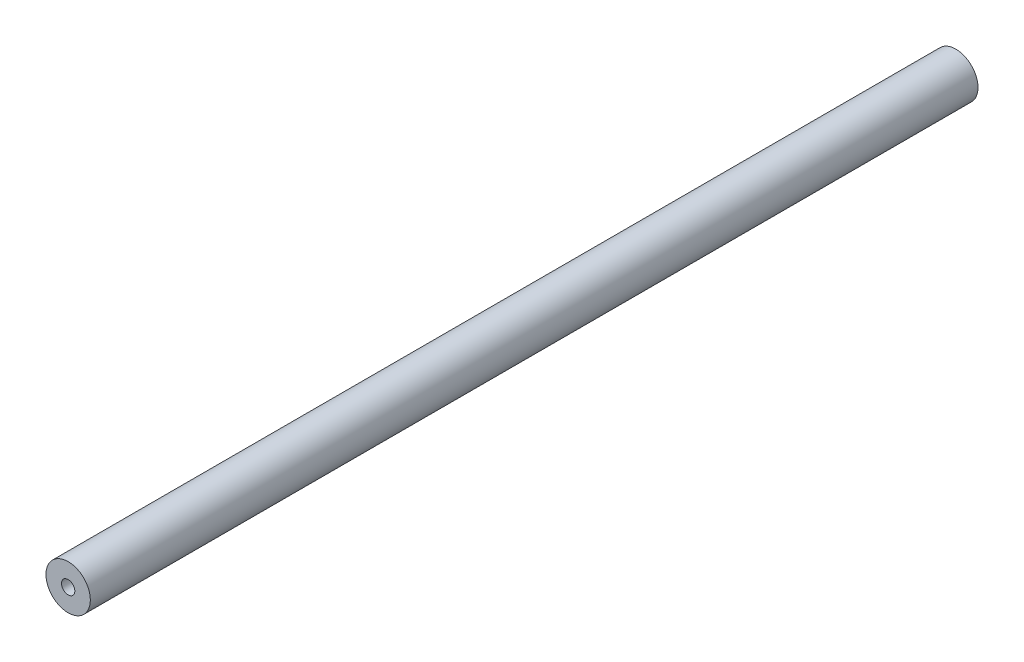
ISO-10303-21;
HEADER;
FILE_DESCRIPTION(('STEP AP214'),'2;1');
FILE_NAME('part.step','',(''),(''),'','','');
FILE_SCHEMA(('AUTOMOTIVE_DESIGN { 1 0 10303 214 1 1 1 1 }'));
ENDSEC;
DATA;
#1=APPLICATION_CONTEXT('core data for automotive mechanical design processes');
#2=APPLICATION_PROTOCOL_DEFINITION('international standard','automotive_design',2000,#1);
#3=PRODUCT_CONTEXT('',#1,'mechanical');
#4=PRODUCT('Part','Part','',(#3));
#5=PRODUCT_RELATED_PRODUCT_CATEGORY('part','',(#4));
#6=PRODUCT_DEFINITION_FORMATION('','',#4);
#7=PRODUCT_DEFINITION_CONTEXT('part definition',#1,'design');
#8=PRODUCT_DEFINITION('design','',#6,#7);
#9=PRODUCT_DEFINITION_SHAPE('','',#8);
#10=(LENGTH_UNIT() NAMED_UNIT(*) SI_UNIT(.MILLI.,.METRE.));
#11=(NAMED_UNIT(*) PLANE_ANGLE_UNIT() SI_UNIT($,.RADIAN.));
#12=(NAMED_UNIT(*) SI_UNIT($,.STERADIAN.) SOLID_ANGLE_UNIT());
#13=UNCERTAINTY_MEASURE_WITH_UNIT(LENGTH_MEASURE(1.E-05),#10,'distance_accuracy_value','');
#14=(GEOMETRIC_REPRESENTATION_CONTEXT(3) GLOBAL_UNCERTAINTY_ASSIGNED_CONTEXT((#13)) GLOBAL_UNIT_ASSIGNED_CONTEXT((#10,
#11,#12)) REPRESENTATION_CONTEXT('',''));
#15=CARTESIAN_POINT('',(0.,0.,0.));
#16=DIRECTION('',(0.,0.,1.));
#17=DIRECTION('',(1.,0.,0.));
#18=AXIS2_PLACEMENT_3D('',#15,#16,#17);
#19=CARTESIAN_POINT('',(0.,0.,400.));
#20=DIRECTION('',(0.,0.,-1.));
#21=DIRECTION('',(-1.,0.,0.));
#22=AXIS2_PLACEMENT_3D('',#19,#20,#21);
#23=CYLINDRICAL_SURFACE('',#22,10.);
#24=CARTESIAN_POINT('',(0.,0.,400.));
#25=DIRECTION('',(0.,0.,1.));
#26=DIRECTION('',(1.,0.,0.));
#27=AXIS2_PLACEMENT_3D('',#24,#25,#26);
#28=CIRCLE('',#27,10.);
#29=CARTESIAN_POINT('',(10.,0.,400.));
#30=VERTEX_POINT('',#29);
#31=EDGE_CURVE('E10',#30,#30,#28,.T.);
#32=ORIENTED_EDGE('',*,*,#31,.F.);
#33=EDGE_LOOP('',(#32));
#34=FACE_BOUND('',#33,.T.);
#35=CARTESIAN_POINT('',(0.,0.,0.));
#36=DIRECTION('',(0.,0.,1.));
#37=DIRECTION('',(1.,0.,0.));
#38=AXIS2_PLACEMENT_3D('',#35,#36,#37);
#39=CIRCLE('',#38,10.);
#40=CARTESIAN_POINT('',(10.,0.,0.));
#41=VERTEX_POINT('',#40);
#42=EDGE_CURVE('E33',#41,#41,#39,.T.);
#43=ORIENTED_EDGE('',*,*,#42,.T.);
#44=EDGE_LOOP('',(#43));
#45=FACE_BOUND('',#44,.T.);
#46=ADVANCED_FACE('F30',(#34,#45),#23,.T.);
#47=CARTESIAN_POINT('',(0.,0.,400.));
#48=DIRECTION('',(0.,0.,1.));
#49=DIRECTION('',(1.,0.,0.));
#50=AXIS2_PLACEMENT_3D('',#47,#48,#49);
#51=PLANE('',#50);
#52=CARTESIAN_POINT('',(0.,0.,400.));
#53=DIRECTION('',(0.,0.,1.));
#54=DIRECTION('',(1.,0.,0.));
#55=AXIS2_PLACEMENT_3D('',#52,#53,#54);
#56=CIRCLE('',#55,3.);
#57=CARTESIAN_POINT('',(3.,0.,400.));
#58=VERTEX_POINT('',#57);
#59=EDGE_CURVE('E42',#58,#58,#56,.T.);
#60=ORIENTED_EDGE('',*,*,#59,.F.);
#61=EDGE_LOOP('',(#60));
#62=FACE_BOUND('',#61,.T.);
#63=ORIENTED_EDGE('',*,*,#31,.T.);
#64=EDGE_LOOP('',(#63));
#65=FACE_BOUND('',#64,.T.);
#66=ADVANCED_FACE('F67',(#62,#65),#51,.T.);
#67=CARTESIAN_POINT('',(0.,0.,0.));
#68=DIRECTION('',(0.,0.,1.));
#69=DIRECTION('',(1.,0.,0.));
#70=AXIS2_PLACEMENT_3D('',#67,#68,#69);
#71=PLANE('',#70);
#72=CARTESIAN_POINT('',(0.,0.,0.));
#73=DIRECTION('',(0.,0.,-1.));
#74=DIRECTION('',(-1.,0.,0.));
#75=AXIS2_PLACEMENT_3D('',#72,#73,#74);
#76=CIRCLE('',#75,3.);
#77=CARTESIAN_POINT('',(-3.,0.,0.));
#78=VERTEX_POINT('',#77);
#79=EDGE_CURVE('E48',#78,#78,#76,.T.);
#80=ORIENTED_EDGE('',*,*,#79,.F.);
#81=EDGE_LOOP('',(#80));
#82=FACE_BOUND('',#81,.T.);
#83=ORIENTED_EDGE('',*,*,#42,.F.);
#84=EDGE_LOOP('',(#83));
#85=FACE_BOUND('',#84,.T.);
#86=ADVANCED_FACE('F63',(#82,#85),#71,.F.);
#87=CARTESIAN_POINT('',(0.,0.,380.));
#88=DIRECTION('',(0.,0.,1.));
#89=DIRECTION('',(1.,0.,0.));
#90=AXIS2_PLACEMENT_3D('',#87,#88,#89);
#91=CYLINDRICAL_SURFACE('',#90,3.);
#92=CARTESIAN_POINT('',(0.,0.,380.));
#93=DIRECTION('',(0.,0.,1.));
#94=DIRECTION('',(1.,0.,0.));
#95=AXIS2_PLACEMENT_3D('',#92,#93,#94);
#96=CIRCLE('',#95,3.);
#97=CARTESIAN_POINT('',(3.,0.,380.));
#98=VERTEX_POINT('',#97);
#99=EDGE_CURVE('E40',#98,#98,#96,.T.);
#100=ORIENTED_EDGE('',*,*,#99,.F.);
#101=EDGE_LOOP('',(#100));
#102=FACE_BOUND('',#101,.T.);
#103=ORIENTED_EDGE('',*,*,#59,.T.);
#104=EDGE_LOOP('',(#103));
#105=FACE_BOUND('',#104,.T.);
#106=ADVANCED_FACE('F66',(#102,#105),#91,.F.);
#107=CARTESIAN_POINT('',(0.,0.,380.));
#108=DIRECTION('',(0.,0.,1.));
#109=DIRECTION('',(1.,0.,0.));
#110=AXIS2_PLACEMENT_3D('',#107,#108,#109);
#111=PLANE('',#110);
#112=ORIENTED_EDGE('',*,*,#99,.T.);
#113=EDGE_LOOP('',(#112));
#114=FACE_BOUND('',#113,.T.);
#115=ADVANCED_FACE('F59',(#114),#111,.T.);
#116=CARTESIAN_POINT('',(0.,0.,20.));
#117=DIRECTION('',(0.,0.,-1.));
#118=DIRECTION('',(-1.,0.,0.));
#119=AXIS2_PLACEMENT_3D('',#116,#117,#118);
#120=CYLINDRICAL_SURFACE('',#119,3.);
#121=CARTESIAN_POINT('',(0.,0.,20.));
#122=DIRECTION('',(0.,0.,-1.));
#123=DIRECTION('',(-1.,0.,0.));
#124=AXIS2_PLACEMENT_3D('',#121,#122,#123);
#125=CIRCLE('',#124,3.);
#126=CARTESIAN_POINT('',(-3.,0.,20.));
#127=VERTEX_POINT('',#126);
#128=EDGE_CURVE('E45',#127,#127,#125,.T.);
#129=ORIENTED_EDGE('',*,*,#128,.F.);
#130=EDGE_LOOP('',(#129));
#131=FACE_BOUND('',#130,.T.);
#132=ORIENTED_EDGE('',*,*,#79,.T.);
#133=EDGE_LOOP('',(#132));
#134=FACE_BOUND('',#133,.T.);
#135=ADVANCED_FACE('F56',(#131,#134),#120,.F.);
#136=CARTESIAN_POINT('',(0.,0.,20.));
#137=DIRECTION('',(0.,0.,-1.));
#138=DIRECTION('',(-1.,0.,0.));
#139=AXIS2_PLACEMENT_3D('',#136,#137,#138);
#140=PLANE('',#139);
#141=ORIENTED_EDGE('',*,*,#128,.T.);
#142=EDGE_LOOP('',(#141));
#143=FACE_BOUND('',#142,.T.);
#144=ADVANCED_FACE('F54',(#143),#140,.T.);
#145=CLOSED_SHELL('',(#46,#66,#86,#106,#115,#135,#144));
#146=MANIFOLD_SOLID_BREP('B2',#145);
#147=ADVANCED_BREP_SHAPE_REPRESENTATION('',(#18,#146),#14);
#148=SHAPE_DEFINITION_REPRESENTATION(#9,#147);
ENDSEC;
END-ISO-10303-21;
